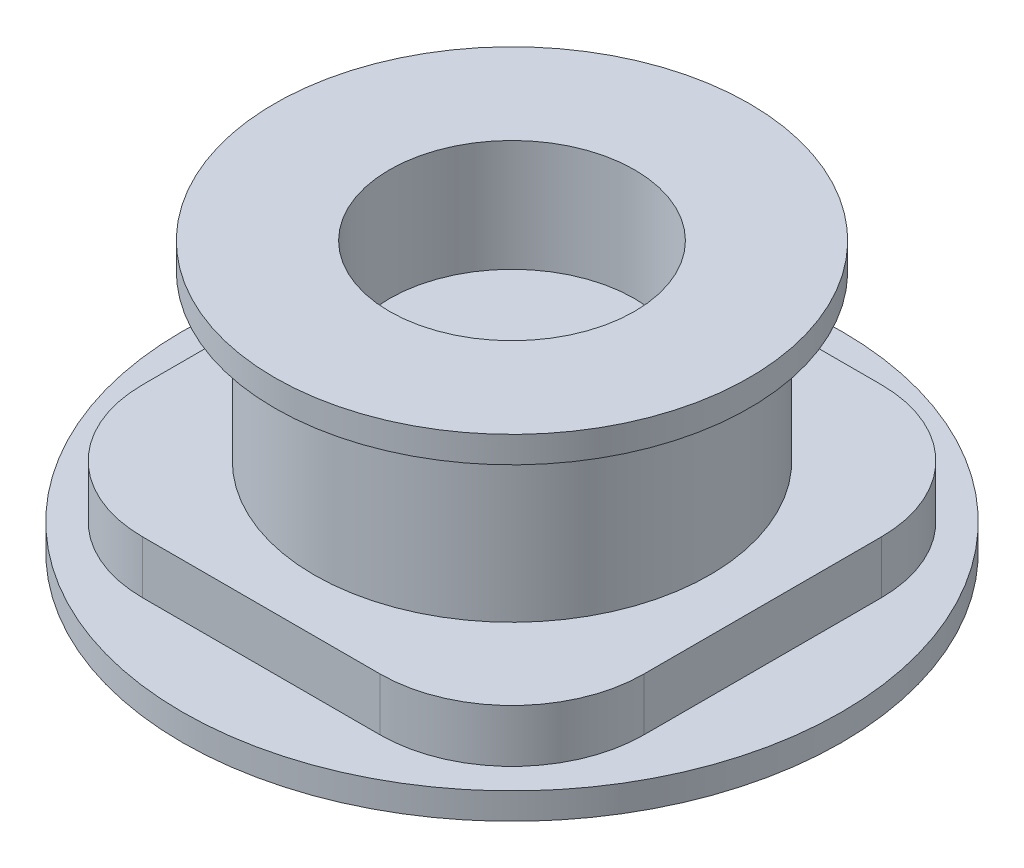
ISO-10303-21;
HEADER;
FILE_DESCRIPTION(('STEP AP214'),'2;1');
FILE_NAME('part.step','',(''),(''),'','','');
FILE_SCHEMA(('AUTOMOTIVE_DESIGN { 1 0 10303 214 1 1 1 1 }'));
ENDSEC;
DATA;
#1=APPLICATION_CONTEXT('core data for automotive mechanical design processes');
#2=APPLICATION_PROTOCOL_DEFINITION('international standard','automotive_design',2000,#1);
#3=PRODUCT_CONTEXT('',#1,'mechanical');
#4=PRODUCT('Part','Part','',(#3));
#5=PRODUCT_RELATED_PRODUCT_CATEGORY('part','',(#4));
#6=PRODUCT_DEFINITION_FORMATION('','',#4);
#7=PRODUCT_DEFINITION_CONTEXT('part definition',#1,'design');
#8=PRODUCT_DEFINITION('design','',#6,#7);
#9=PRODUCT_DEFINITION_SHAPE('','',#8);
#10=(LENGTH_UNIT() NAMED_UNIT(*) SI_UNIT(.MILLI.,.METRE.));
#11=(NAMED_UNIT(*) PLANE_ANGLE_UNIT() SI_UNIT($,.RADIAN.));
#12=(NAMED_UNIT(*) SI_UNIT($,.STERADIAN.) SOLID_ANGLE_UNIT());
#13=UNCERTAINTY_MEASURE_WITH_UNIT(LENGTH_MEASURE(1.E-05),#10,'distance_accuracy_value','');
#14=(GEOMETRIC_REPRESENTATION_CONTEXT(3) GLOBAL_UNCERTAINTY_ASSIGNED_CONTEXT((#13)) GLOBAL_UNIT_ASSIGNED_CONTEXT((#10,
#11,#12)) REPRESENTATION_CONTEXT('',''));
#15=CARTESIAN_POINT('',(0.,0.,0.));
#16=DIRECTION('',(0.,0.,1.));
#17=DIRECTION('',(1.,0.,0.));
#18=AXIS2_PLACEMENT_3D('',#15,#16,#17);
#19=CARTESIAN_POINT('',(0.,50.,0.));
#20=DIRECTION('',(0.,1.,0.));
#21=DIRECTION('',(0.,0.,1.));
#22=AXIS2_PLACEMENT_3D('',#19,#20,#21);
#23=PLANE('',#22);
#24=CARTESIAN_POINT('',(0.,50.,0.));
#25=DIRECTION('',(0.,1.,0.));
#26=DIRECTION('',(0.,0.,1.));
#27=AXIS2_PLACEMENT_3D('',#24,#25,#26);
#28=CIRCLE('',#27,46.5);
#29=CARTESIAN_POINT('',(0.,50.,46.5));
#30=VERTEX_POINT('',#29);
#31=EDGE_CURVE('E401',#30,#30,#28,.T.);
#32=ORIENTED_EDGE('',*,*,#31,.T.);
#33=EDGE_LOOP('',(#32));
#34=FACE_BOUND('',#33,.T.);
#35=ADVANCED_FACE('F37',(#34),#23,.T.);
#36=CARTESIAN_POINT('',(0.,50.,0.));
#37=DIRECTION('',(0.,1.,0.));
#38=DIRECTION('',(0.,0.,1.));
#39=AXIS2_PLACEMENT_3D('',#36,#37,#38);
#40=CYLINDRICAL_SURFACE('',#39,46.5);
#41=ORIENTED_EDGE('',*,*,#31,.F.);
#42=EDGE_LOOP('',(#41));
#43=FACE_BOUND('',#42,.T.);
#44=CARTESIAN_POINT('',(0.,92.3,0.));
#45=DIRECTION('',(0.,1.,0.));
#46=DIRECTION('',(0.,0.,1.));
#47=AXIS2_PLACEMENT_3D('',#44,#45,#46);
#48=CIRCLE('',#47,46.5);
#49=CARTESIAN_POINT('',(0.,92.3,46.5));
#50=VERTEX_POINT('',#49);
#51=EDGE_CURVE('E397',#50,#50,#48,.T.);
#52=ORIENTED_EDGE('',*,*,#51,.T.);
#53=EDGE_LOOP('',(#52));
#54=FACE_BOUND('',#53,.T.);
#55=ADVANCED_FACE('F199',(#43,#54),#40,.F.);
#56=CARTESIAN_POINT('',(95.,20.,-95.));
#57=DIRECTION('',(-1.,0.,0.));
#58=DIRECTION('',(0.,0.,1.));
#59=AXIS2_PLACEMENT_3D('',#56,#57,#58);
#60=PLANE('',#59);
#61=DIRECTION('',(0.,0.,-1.));
#62=VECTOR('',#61,1.);
#63=CARTESIAN_POINT('',(95.,20.,-95.));
#64=LINE('',#63,#62);
#65=CARTESIAN_POINT('',(95.,20.,45.));
#66=VERTEX_POINT('',#65);
#67=CARTESIAN_POINT('',(95.,20.,-45.));
#68=VERTEX_POINT('',#67);
#69=EDGE_CURVE('E161',#66,#68,#64,.T.);
#70=ORIENTED_EDGE('',*,*,#69,.F.);
#71=DIRECTION('',(0.,-1.,0.));
#72=VECTOR('',#71,1.);
#73=CARTESIAN_POINT('',(95.,20.,45.));
#74=LINE('',#73,#72);
#75=CARTESIAN_POINT('',(95.,0.,45.));
#76=VERTEX_POINT('',#75);
#77=EDGE_CURVE('E114',#66,#76,#74,.T.);
#78=ORIENTED_EDGE('',*,*,#77,.T.);
#79=DIRECTION('',(0.,0.,-1.));
#80=VECTOR('',#79,1.);
#81=CARTESIAN_POINT('',(95.,0.,-95.));
#82=LINE('',#81,#80);
#83=CARTESIAN_POINT('',(95.,0.,-45.));
#84=VERTEX_POINT('',#83);
#85=EDGE_CURVE('E119',#76,#84,#82,.T.);
#86=ORIENTED_EDGE('',*,*,#85,.T.);
#87=DIRECTION('',(0.,-1.,0.));
#88=VECTOR('',#87,1.);
#89=CARTESIAN_POINT('',(95.,20.,-45.));
#90=LINE('',#89,#88);
#91=EDGE_CURVE('E103',#84,#68,#90,.F.);
#92=ORIENTED_EDGE('',*,*,#91,.T.);
#93=EDGE_LOOP('',(#70,#78,#86,#92));
#94=FACE_BOUND('',#93,.T.);
#95=ADVANCED_FACE('F120',(#94),#60,.F.);
#96=CARTESIAN_POINT('',(-95.,20.,-95.));
#97=DIRECTION('',(0.,0.,1.));
#98=DIRECTION('',(1.,0.,0.));
#99=AXIS2_PLACEMENT_3D('',#96,#97,#98);
#100=PLANE('',#99);
#101=DIRECTION('',(-1.,0.,0.));
#102=VECTOR('',#101,1.);
#103=CARTESIAN_POINT('',(-95.,20.,-95.));
#104=LINE('',#103,#102);
#105=CARTESIAN_POINT('',(45.,20.,-95.));
#106=VERTEX_POINT('',#105);
#107=CARTESIAN_POINT('',(-45.,20.,-95.));
#108=VERTEX_POINT('',#107);
#109=EDGE_CURVE('E159',#106,#108,#104,.T.);
#110=ORIENTED_EDGE('',*,*,#109,.F.);
#111=DIRECTION('',(0.,-1.,0.));
#112=VECTOR('',#111,1.);
#113=CARTESIAN_POINT('',(45.,20.,-95.));
#114=LINE('',#113,#112);
#115=CARTESIAN_POINT('',(45.,0.,-95.));
#116=VERTEX_POINT('',#115);
#117=EDGE_CURVE('E41',#106,#116,#114,.T.);
#118=ORIENTED_EDGE('',*,*,#117,.T.);
#119=DIRECTION('',(-1.,0.,0.));
#120=VECTOR('',#119,1.);
#121=CARTESIAN_POINT('',(-95.,0.,-95.));
#122=LINE('',#121,#120);
#123=CARTESIAN_POINT('',(-45.,0.,-95.));
#124=VERTEX_POINT('',#123);
#125=EDGE_CURVE('E124',#116,#124,#122,.T.);
#126=ORIENTED_EDGE('',*,*,#125,.T.);
#127=DIRECTION('',(0.,-1.,0.));
#128=VECTOR('',#127,1.);
#129=CARTESIAN_POINT('',(-45.,20.,-95.));
#130=LINE('',#129,#128);
#131=EDGE_CURVE('E154',#124,#108,#130,.F.);
#132=ORIENTED_EDGE('',*,*,#131,.T.);
#133=EDGE_LOOP('',(#110,#118,#126,#132));
#134=FACE_BOUND('',#133,.T.);
#135=ADVANCED_FACE('F158',(#134),#100,.F.);
#136=CARTESIAN_POINT('',(-95.,20.,-95.));
#137=DIRECTION('',(1.,0.,0.));
#138=DIRECTION('',(0.,0.,-1.));
#139=AXIS2_PLACEMENT_3D('',#136,#137,#138);
#140=PLANE('',#139);
#141=DIRECTION('',(0.,0.,1.));
#142=VECTOR('',#141,1.);
#143=CARTESIAN_POINT('',(-95.,0.,-95.));
#144=LINE('',#143,#142);
#145=CARTESIAN_POINT('',(-95.,0.,-45.));
#146=VERTEX_POINT('',#145);
#147=CARTESIAN_POINT('',(-95.,0.,45.));
#148=VERTEX_POINT('',#147);
#149=EDGE_CURVE('E170',#146,#148,#144,.T.);
#150=ORIENTED_EDGE('',*,*,#149,.T.);
#151=DIRECTION('',(0.,-1.,0.));
#152=VECTOR('',#151,1.);
#153=CARTESIAN_POINT('',(-95.,20.,45.));
#154=LINE('',#153,#152);
#155=CARTESIAN_POINT('',(-95.,20.,45.));
#156=VERTEX_POINT('',#155);
#157=EDGE_CURVE('E53',#148,#156,#154,.F.);
#158=ORIENTED_EDGE('',*,*,#157,.T.);
#159=DIRECTION('',(0.,0.,1.));
#160=VECTOR('',#159,1.);
#161=CARTESIAN_POINT('',(-95.,20.,-95.));
#162=LINE('',#161,#160);
#163=CARTESIAN_POINT('',(-95.,20.,-45.));
#164=VERTEX_POINT('',#163);
#165=EDGE_CURVE('E160',#164,#156,#162,.T.);
#166=ORIENTED_EDGE('',*,*,#165,.F.);
#167=DIRECTION('',(0.,-1.,0.));
#168=VECTOR('',#167,1.);
#169=CARTESIAN_POINT('',(-95.,20.,-45.));
#170=LINE('',#169,#168);
#171=EDGE_CURVE('E151',#164,#146,#170,.T.);
#172=ORIENTED_EDGE('',*,*,#171,.T.);
#173=EDGE_LOOP('',(#150,#158,#166,#172));
#174=FACE_BOUND('',#173,.T.);
#175=ADVANCED_FACE('F186',(#174),#140,.F.);
#176=CARTESIAN_POINT('',(-95.,20.,95.));
#177=DIRECTION('',(0.,0.,-1.));
#178=DIRECTION('',(-1.,0.,0.));
#179=AXIS2_PLACEMENT_3D('',#176,#177,#178);
#180=PLANE('',#179);
#181=DIRECTION('',(1.,0.,0.));
#182=VECTOR('',#181,1.);
#183=CARTESIAN_POINT('',(-95.,0.,95.));
#184=LINE('',#183,#182);
#185=CARTESIAN_POINT('',(-45.,0.,95.));
#186=VERTEX_POINT('',#185);
#187=CARTESIAN_POINT('',(45.,0.,95.));
#188=VERTEX_POINT('',#187);
#189=EDGE_CURVE('E164',#186,#188,#184,.T.);
#190=ORIENTED_EDGE('',*,*,#189,.T.);
#191=DIRECTION('',(0.,-1.,0.));
#192=VECTOR('',#191,1.);
#193=CARTESIAN_POINT('',(45.,20.,95.));
#194=LINE('',#193,#192);
#195=CARTESIAN_POINT('',(45.,20.,95.));
#196=VERTEX_POINT('',#195);
#197=EDGE_CURVE('E143',#188,#196,#194,.F.);
#198=ORIENTED_EDGE('',*,*,#197,.T.);
#199=DIRECTION('',(1.,0.,0.));
#200=VECTOR('',#199,1.);
#201=CARTESIAN_POINT('',(-95.,20.,95.));
#202=LINE('',#201,#200);
#203=CARTESIAN_POINT('',(-45.,20.,95.));
#204=VERTEX_POINT('',#203);
#205=EDGE_CURVE('E115',#204,#196,#202,.T.);
#206=ORIENTED_EDGE('',*,*,#205,.F.);
#207=DIRECTION('',(0.,-1.,0.));
#208=VECTOR('',#207,1.);
#209=CARTESIAN_POINT('',(-45.,20.,95.));
#210=LINE('',#209,#208);
#211=EDGE_CURVE('E140',#204,#186,#210,.T.);
#212=ORIENTED_EDGE('',*,*,#211,.T.);
#213=EDGE_LOOP('',(#190,#198,#206,#212));
#214=FACE_BOUND('',#213,.T.);
#215=ADVANCED_FACE('F175',(#214),#180,.F.);
#216=CARTESIAN_POINT('',(0.,20.,0.));
#217=DIRECTION('',(0.,1.,0.));
#218=DIRECTION('',(0.,0.,1.));
#219=AXIS2_PLACEMENT_3D('',#216,#217,#218);
#220=PLANE('',#219);
#221=CARTESIAN_POINT('',(0.,20.,0.));
#222=DIRECTION('',(0.,1.,0.));
#223=DIRECTION('',(0.,0.,1.));
#224=AXIS2_PLACEMENT_3D('',#221,#222,#223);
#225=CIRCLE('',#224,75.);
#226=CARTESIAN_POINT('',(0.,20.,75.));
#227=VERTEX_POINT('',#226);
#228=EDGE_CURVE('E11',#227,#227,#225,.T.);
#229=ORIENTED_EDGE('',*,*,#228,.F.);
#230=EDGE_LOOP('',(#229));
#231=FACE_BOUND('',#230,.T.);
#232=ORIENTED_EDGE('',*,*,#205,.T.);
#233=CARTESIAN_POINT('',(45.,20.,45.));
#234=DIRECTION('',(0.,1.,0.));
#235=DIRECTION('',(0.,0.,1.));
#236=AXIS2_PLACEMENT_3D('',#233,#234,#235);
#237=CIRCLE('',#236,50.);
#238=EDGE_CURVE('E149',#196,#66,#237,.T.);
#239=ORIENTED_EDGE('',*,*,#238,.T.);
#240=ORIENTED_EDGE('',*,*,#69,.T.);
#241=CARTESIAN_POINT('',(45.,20.,-45.));
#242=DIRECTION('',(0.,1.,0.));
#243=DIRECTION('',(0.,0.,1.));
#244=AXIS2_PLACEMENT_3D('',#241,#242,#243);
#245=CIRCLE('',#244,50.);
#246=EDGE_CURVE('E110',#68,#106,#245,.T.);
#247=ORIENTED_EDGE('',*,*,#246,.T.);
#248=ORIENTED_EDGE('',*,*,#109,.T.);
#249=CARTESIAN_POINT('',(-45.,20.,-45.));
#250=DIRECTION('',(0.,1.,0.));
#251=DIRECTION('',(0.,0.,1.));
#252=AXIS2_PLACEMENT_3D('',#249,#250,#251);
#253=CIRCLE('',#252,50.);
#254=EDGE_CURVE('E60',#108,#164,#253,.T.);
#255=ORIENTED_EDGE('',*,*,#254,.T.);
#256=ORIENTED_EDGE('',*,*,#165,.T.);
#257=CARTESIAN_POINT('',(-45.,20.,45.));
#258=DIRECTION('',(0.,1.,0.));
#259=DIRECTION('',(0.,0.,1.));
#260=AXIS2_PLACEMENT_3D('',#257,#258,#259);
#261=CIRCLE('',#260,50.);
#262=EDGE_CURVE('E147',#156,#204,#261,.T.);
#263=ORIENTED_EDGE('',*,*,#262,.T.);
#264=EDGE_LOOP('',(#232,#239,#240,#247,#248,#255,#256,#263));
#265=FACE_BOUND('',#264,.T.);
#266=ADVANCED_FACE('F181',(#231,#265),#220,.T.);
#267=CARTESIAN_POINT('',(45.,20.,45.));
#268=DIRECTION('',(0.,-1.,0.));
#269=DIRECTION('',(0.,0.,-1.));
#270=AXIS2_PLACEMENT_3D('',#267,#268,#269);
#271=CYLINDRICAL_SURFACE('',#270,50.);
#272=ORIENTED_EDGE('',*,*,#238,.F.);
#273=ORIENTED_EDGE('',*,*,#197,.F.);
#274=CARTESIAN_POINT('',(45.,0.,45.));
#275=DIRECTION('',(0.,1.,0.));
#276=DIRECTION('',(0.,0.,1.));
#277=AXIS2_PLACEMENT_3D('',#274,#275,#276);
#278=CIRCLE('',#277,50.);
#279=EDGE_CURVE('E134',#76,#188,#278,.F.);
#280=ORIENTED_EDGE('',*,*,#279,.F.);
#281=ORIENTED_EDGE('',*,*,#77,.F.);
#282=EDGE_LOOP('',(#272,#273,#280,#281));
#283=FACE_BOUND('',#282,.T.);
#284=ADVANCED_FACE('F180',(#283),#271,.T.);
#285=CARTESIAN_POINT('',(-45.,20.,45.));
#286=DIRECTION('',(0.,-1.,0.));
#287=DIRECTION('',(0.,0.,-1.));
#288=AXIS2_PLACEMENT_3D('',#285,#286,#287);
#289=CYLINDRICAL_SURFACE('',#288,50.);
#290=ORIENTED_EDGE('',*,*,#262,.F.);
#291=ORIENTED_EDGE('',*,*,#157,.F.);
#292=CARTESIAN_POINT('',(-45.,0.,45.));
#293=DIRECTION('',(0.,1.,0.));
#294=DIRECTION('',(0.,0.,1.));
#295=AXIS2_PLACEMENT_3D('',#292,#293,#294);
#296=CIRCLE('',#295,50.);
#297=EDGE_CURVE('E130',#186,#148,#296,.F.);
#298=ORIENTED_EDGE('',*,*,#297,.F.);
#299=ORIENTED_EDGE('',*,*,#211,.F.);
#300=EDGE_LOOP('',(#290,#291,#298,#299));
#301=FACE_BOUND('',#300,.T.);
#302=ADVANCED_FACE('F184',(#301),#289,.T.);
#303=CARTESIAN_POINT('',(45.,20.,-45.));
#304=DIRECTION('',(0.,-1.,0.));
#305=DIRECTION('',(0.,0.,-1.));
#306=AXIS2_PLACEMENT_3D('',#303,#304,#305);
#307=CYLINDRICAL_SURFACE('',#306,50.);
#308=ORIENTED_EDGE('',*,*,#246,.F.);
#309=ORIENTED_EDGE('',*,*,#91,.F.);
#310=CARTESIAN_POINT('',(45.,0.,-45.));
#311=DIRECTION('',(0.,1.,0.));
#312=DIRECTION('',(0.,0.,1.));
#313=AXIS2_PLACEMENT_3D('',#310,#311,#312);
#314=CIRCLE('',#313,50.);
#315=EDGE_CURVE('E108',#116,#84,#314,.F.);
#316=ORIENTED_EDGE('',*,*,#315,.F.);
#317=ORIENTED_EDGE('',*,*,#117,.F.);
#318=EDGE_LOOP('',(#308,#309,#316,#317));
#319=FACE_BOUND('',#318,.T.);
#320=ADVANCED_FACE('F105',(#319),#307,.T.);
#321=CARTESIAN_POINT('',(-45.,20.,-45.));
#322=DIRECTION('',(0.,-1.,0.));
#323=DIRECTION('',(0.,0.,-1.));
#324=AXIS2_PLACEMENT_3D('',#321,#322,#323);
#325=CYLINDRICAL_SURFACE('',#324,50.);
#326=ORIENTED_EDGE('',*,*,#254,.F.);
#327=ORIENTED_EDGE('',*,*,#131,.F.);
#328=CARTESIAN_POINT('',(-45.,0.,-45.));
#329=DIRECTION('',(0.,1.,0.));
#330=DIRECTION('',(0.,0.,1.));
#331=AXIS2_PLACEMENT_3D('',#328,#329,#330);
#332=CIRCLE('',#331,50.);
#333=EDGE_CURVE('E131',#146,#124,#332,.F.);
#334=ORIENTED_EDGE('',*,*,#333,.F.);
#335=ORIENTED_EDGE('',*,*,#171,.F.);
#336=EDGE_LOOP('',(#326,#327,#334,#335));
#337=FACE_BOUND('',#336,.T.);
#338=ADVANCED_FACE('F39',(#337),#325,.T.);
#339=CARTESIAN_POINT('',(0.,62.3,0.));
#340=DIRECTION('',(0.,-1.,0.));
#341=DIRECTION('',(0.,0.,-1.));
#342=AXIS2_PLACEMENT_3D('',#339,#340,#341);
#343=CYLINDRICAL_SURFACE('',#342,75.);
#344=ORIENTED_EDGE('',*,*,#228,.T.);
#345=EDGE_LOOP('',(#344));
#346=FACE_BOUND('',#345,.T.);
#347=CARTESIAN_POINT('',(0.,82.3,0.));
#348=DIRECTION('',(0.,1.,0.));
#349=DIRECTION('',(0.,0.,1.));
#350=AXIS2_PLACEMENT_3D('',#347,#348,#349);
#351=CIRCLE('',#350,75.);
#352=CARTESIAN_POINT('',(0.,82.3,75.));
#353=VERTEX_POINT('',#352);
#354=EDGE_CURVE('E125',#353,#353,#351,.T.);
#355=ORIENTED_EDGE('',*,*,#354,.F.);
#356=EDGE_LOOP('',(#355));
#357=FACE_BOUND('',#356,.T.);
#358=ADVANCED_FACE('F190',(#346,#357),#343,.T.);
#359=CARTESIAN_POINT('',(0.,92.3,0.));
#360=DIRECTION('',(0.,-1.,0.));
#361=DIRECTION('',(0.,0.,-1.));
#362=AXIS2_PLACEMENT_3D('',#359,#360,#361);
#363=CYLINDRICAL_SURFACE('',#362,90.);
#364=CARTESIAN_POINT('',(0.,92.3,0.));
#365=DIRECTION('',(0.,1.,0.));
#366=DIRECTION('',(0.,0.,1.));
#367=AXIS2_PLACEMENT_3D('',#364,#365,#366);
#368=CIRCLE('',#367,90.);
#369=CARTESIAN_POINT('',(0.,92.3,90.));
#370=VERTEX_POINT('',#369);
#371=EDGE_CURVE('E408',#370,#370,#368,.T.);
#372=ORIENTED_EDGE('',*,*,#371,.F.);
#373=EDGE_LOOP('',(#372));
#374=FACE_BOUND('',#373,.T.);
#375=CARTESIAN_POINT('',(0.,82.3,0.));
#376=DIRECTION('',(0.,1.,0.));
#377=DIRECTION('',(0.,0.,1.));
#378=AXIS2_PLACEMENT_3D('',#375,#376,#377);
#379=CIRCLE('',#378,90.);
#380=CARTESIAN_POINT('',(0.,82.3,90.));
#381=VERTEX_POINT('',#380);
#382=EDGE_CURVE('E407',#381,#381,#379,.T.);
#383=ORIENTED_EDGE('',*,*,#382,.T.);
#384=EDGE_LOOP('',(#383));
#385=FACE_BOUND('',#384,.T.);
#386=ADVANCED_FACE('F195',(#374,#385),#363,.T.);
#387=CARTESIAN_POINT('',(0.,92.3,0.));
#388=DIRECTION('',(0.,1.,0.));
#389=DIRECTION('',(0.,0.,1.));
#390=AXIS2_PLACEMENT_3D('',#387,#388,#389);
#391=PLANE('',#390);
#392=ORIENTED_EDGE('',*,*,#51,.F.);
#393=EDGE_LOOP('',(#392));
#394=FACE_BOUND('',#393,.T.);
#395=ORIENTED_EDGE('',*,*,#371,.T.);
#396=EDGE_LOOP('',(#395));
#397=FACE_BOUND('',#396,.T.);
#398=ADVANCED_FACE('F212',(#394,#397),#391,.T.);
#399=CARTESIAN_POINT('',(0.,82.3,0.));
#400=DIRECTION('',(0.,1.,0.));
#401=DIRECTION('',(0.,0.,1.));
#402=AXIS2_PLACEMENT_3D('',#399,#400,#401);
#403=PLANE('',#402);
#404=ORIENTED_EDGE('',*,*,#354,.T.);
#405=EDGE_LOOP('',(#404));
#406=FACE_BOUND('',#405,.T.);
#407=ORIENTED_EDGE('',*,*,#382,.F.);
#408=EDGE_LOOP('',(#407));
#409=FACE_BOUND('',#408,.T.);
#410=ADVANCED_FACE('F215',(#406,#409),#403,.F.);
#411=CARTESIAN_POINT('',(0.,0.,0.));
#412=DIRECTION('',(0.,-1.,0.));
#413=DIRECTION('',(0.,0.,-1.));
#414=AXIS2_PLACEMENT_3D('',#411,#412,#413);
#415=PLANE('',#414);
#416=CARTESIAN_POINT('',(0.,0.,0.));
#417=DIRECTION('',(0.,-1.,0.));
#418=DIRECTION('',(0.,0.,-1.));
#419=AXIS2_PLACEMENT_3D('',#416,#417,#418);
#420=CIRCLE('',#419,125.);
#421=CARTESIAN_POINT('',(0.,0.,-125.));
#422=VERTEX_POINT('',#421);
#423=EDGE_CURVE('E398',#422,#422,#420,.T.);
#424=ORIENTED_EDGE('',*,*,#423,.F.);
#425=EDGE_LOOP('',(#424));
#426=FACE_BOUND('',#425,.T.);
#427=ORIENTED_EDGE('',*,*,#85,.F.);
#428=ORIENTED_EDGE('',*,*,#279,.T.);
#429=ORIENTED_EDGE('',*,*,#189,.F.);
#430=ORIENTED_EDGE('',*,*,#297,.T.);
#431=ORIENTED_EDGE('',*,*,#149,.F.);
#432=ORIENTED_EDGE('',*,*,#333,.T.);
#433=ORIENTED_EDGE('',*,*,#125,.F.);
#434=ORIENTED_EDGE('',*,*,#315,.T.);
#435=EDGE_LOOP('',(#427,#428,#429,#430,#431,#432,#433,#434));
#436=FACE_BOUND('',#435,.T.);
#437=ADVANCED_FACE('F128',(#426,#436),#415,.F.);
#438=CARTESIAN_POINT('',(0.,-10.,0.));
#439=DIRECTION('',(0.,1.,0.));
#440=DIRECTION('',(0.,0.,1.));
#441=AXIS2_PLACEMENT_3D('',#438,#439,#440);
#442=CYLINDRICAL_SURFACE('',#441,125.);
#443=CARTESIAN_POINT('',(0.,-10.,0.));
#444=DIRECTION('',(0.,-1.,0.));
#445=DIRECTION('',(0.,0.,-1.));
#446=AXIS2_PLACEMENT_3D('',#443,#444,#445);
#447=CIRCLE('',#446,125.);
#448=CARTESIAN_POINT('',(0.,-10.,-125.));
#449=VERTEX_POINT('',#448);
#450=EDGE_CURVE('E396',#449,#449,#447,.T.);
#451=ORIENTED_EDGE('',*,*,#450,.F.);
#452=EDGE_LOOP('',(#451));
#453=FACE_BOUND('',#452,.T.);
#454=ORIENTED_EDGE('',*,*,#423,.T.);
#455=EDGE_LOOP('',(#454));
#456=FACE_BOUND('',#455,.T.);
#457=ADVANCED_FACE('F209',(#453,#456),#442,.T.);
#458=CARTESIAN_POINT('',(0.,-10.,0.));
#459=DIRECTION('',(0.,-1.,0.));
#460=DIRECTION('',(0.,0.,-1.));
#461=AXIS2_PLACEMENT_3D('',#458,#459,#460);
#462=PLANE('',#461);
#463=ORIENTED_EDGE('',*,*,#450,.T.);
#464=EDGE_LOOP('',(#463));
#465=FACE_BOUND('',#464,.T.);
#466=ADVANCED_FACE('F271',(#465),#462,.T.);
#467=CLOSED_SHELL('',(#35,#55,#95,#135,#175,#215,#266,#284,#302,#320,#338,#358,#386,#398,#410,
#437,#457,#466));
#468=MANIFOLD_SOLID_BREP('B2',#467);
#469=ADVANCED_BREP_SHAPE_REPRESENTATION('',(#18,#468),#14);
#470=SHAPE_DEFINITION_REPRESENTATION(#9,#469);
ENDSEC;
END-ISO-10303-21;
